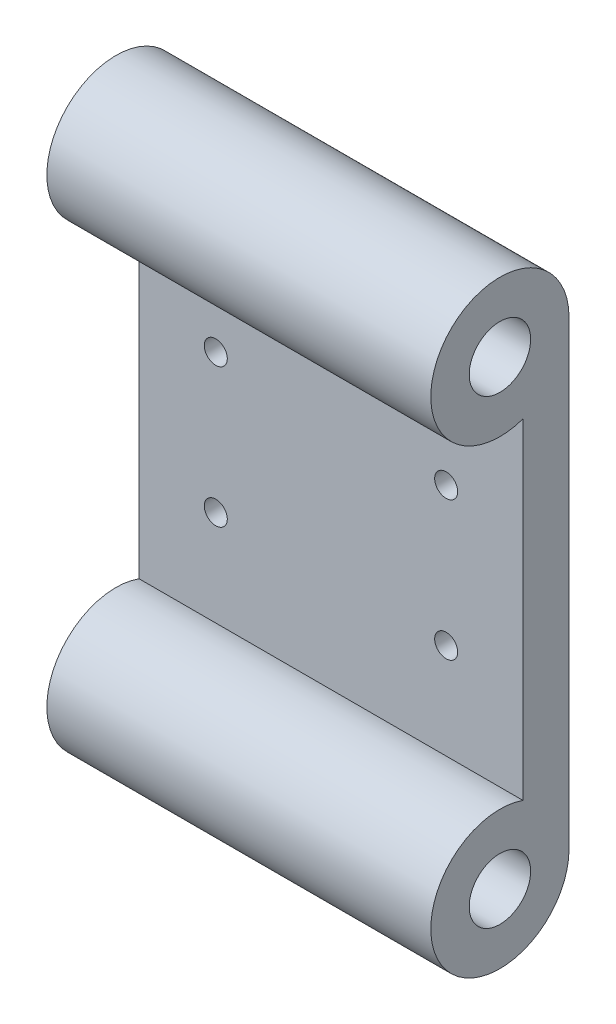
ISO-10303-21;
HEADER;
FILE_DESCRIPTION(('STEP AP214'),'2;1');
FILE_NAME('part.step','',(''),(''),'','','');
FILE_SCHEMA(('AUTOMOTIVE_DESIGN { 1 0 10303 214 1 1 1 1 }'));
ENDSEC;
DATA;
#1=APPLICATION_CONTEXT('core data for automotive mechanical design processes');
#2=APPLICATION_PROTOCOL_DEFINITION('international standard','automotive_design',2000,#1);
#3=PRODUCT_CONTEXT('',#1,'mechanical');
#4=PRODUCT('Part','Part','',(#3));
#5=PRODUCT_RELATED_PRODUCT_CATEGORY('part','',(#4));
#6=PRODUCT_DEFINITION_FORMATION('','',#4);
#7=PRODUCT_DEFINITION_CONTEXT('part definition',#1,'design');
#8=PRODUCT_DEFINITION('design','',#6,#7);
#9=PRODUCT_DEFINITION_SHAPE('','',#8);
#10=(LENGTH_UNIT() NAMED_UNIT(*) SI_UNIT(.MILLI.,.METRE.));
#11=(NAMED_UNIT(*) PLANE_ANGLE_UNIT() SI_UNIT($,.RADIAN.));
#12=(NAMED_UNIT(*) SI_UNIT($,.STERADIAN.) SOLID_ANGLE_UNIT());
#13=UNCERTAINTY_MEASURE_WITH_UNIT(LENGTH_MEASURE(1.E-05),#10,'distance_accuracy_value','');
#14=(GEOMETRIC_REPRESENTATION_CONTEXT(3) GLOBAL_UNCERTAINTY_ASSIGNED_CONTEXT((#13)) GLOBAL_UNIT_ASSIGNED_CONTEXT((#10,
#11,#12)) REPRESENTATION_CONTEXT('',''));
#15=CARTESIAN_POINT('',(0.,0.,0.));
#16=DIRECTION('',(0.,0.,1.));
#17=DIRECTION('',(1.,0.,0.));
#18=AXIS2_PLACEMENT_3D('',#15,#16,#17);
#19=CARTESIAN_POINT('',(50.,30.,0.));
#20=DIRECTION('',(1.,0.,0.));
#21=DIRECTION('',(0.,0.,-1.));
#22=AXIS2_PLACEMENT_3D('',#19,#20,#21);
#23=PLANE('',#22);
#24=CARTESIAN_POINT('',(50.,30.,0.));
#25=DIRECTION('',(1.,0.,0.));
#26=DIRECTION('',(0.,0.,-1.));
#27=AXIS2_PLACEMENT_3D('',#24,#25,#26);
#28=CIRCLE('',#27,4.);
#29=CARTESIAN_POINT('',(50.,30.,-3.99999999999999));
#30=VERTEX_POINT('',#29);
#31=EDGE_CURVE('E102',#30,#30,#28,.T.);
#32=ORIENTED_EDGE('',*,*,#31,.F.);
#33=EDGE_LOOP('',(#32));
#34=FACE_BOUND('',#33,.T.);
#35=CARTESIAN_POINT('',(50.,30.,0.));
#36=DIRECTION('',(1.,0.,0.));
#37=DIRECTION('',(0.,0.,-1.));
#38=AXIS2_PLACEMENT_3D('',#35,#36,#37);
#39=CIRCLE('',#38,9.);
#40=CARTESIAN_POINT('',(50.,30.,-8.99999999999999));
#41=VERTEX_POINT('',#40);
#42=CARTESIAN_POINT('',(50.,21.5147186257614,-2.99999999999999));
#43=VERTEX_POINT('',#42);
#44=EDGE_CURVE('E86',#41,#43,#39,.T.);
#45=ORIENTED_EDGE('',*,*,#44,.T.);
#46=DIRECTION('',(0.,-1.,0.));
#47=VECTOR('',#46,1.);
#48=CARTESIAN_POINT('',(50.,-21.5147186257614,-3.));
#49=LINE('',#48,#47);
#50=CARTESIAN_POINT('',(50.,-21.5147186257614,-3.00000000000001));
#51=VERTEX_POINT('',#50);
#52=EDGE_CURVE('E81',#43,#51,#49,.T.);
#53=ORIENTED_EDGE('',*,*,#52,.T.);
#54=CARTESIAN_POINT('',(50.,-30.,0.));
#55=DIRECTION('',(1.,0.,0.));
#56=DIRECTION('',(0.,0.,-1.));
#57=AXIS2_PLACEMENT_3D('',#54,#55,#56);
#58=CIRCLE('',#57,9.);
#59=CARTESIAN_POINT('',(50.,-30.,-9.00000000000001));
#60=VERTEX_POINT('',#59);
#61=EDGE_CURVE('E84',#51,#60,#58,.T.);
#62=ORIENTED_EDGE('',*,*,#61,.T.);
#63=DIRECTION('',(0.,1.,0.));
#64=VECTOR('',#63,1.);
#65=CARTESIAN_POINT('',(50.,30.,-8.99999999999999));
#66=LINE('',#65,#64);
#67=EDGE_CURVE('E51',#60,#41,#66,.T.);
#68=ORIENTED_EDGE('',*,*,#67,.T.);
#69=EDGE_LOOP('',(#45,#53,#62,#68));
#70=FACE_BOUND('',#69,.T.);
#71=CARTESIAN_POINT('',(50.,-30.,0.));
#72=DIRECTION('',(1.,0.,0.));
#73=DIRECTION('',(0.,0.,-1.));
#74=AXIS2_PLACEMENT_3D('',#71,#72,#73);
#75=CIRCLE('',#74,4.);
#76=CARTESIAN_POINT('',(50.,-30.,-4.00000000000001));
#77=VERTEX_POINT('',#76);
#78=EDGE_CURVE('E131',#77,#77,#75,.T.);
#79=ORIENTED_EDGE('',*,*,#78,.F.);
#80=EDGE_LOOP('',(#79));
#81=FACE_BOUND('',#80,.T.);
#82=ADVANCED_FACE('F32',(#34,#70,#81),#23,.T.);
#83=CARTESIAN_POINT('',(0.,30.,0.));
#84=DIRECTION('',(1.,0.,0.));
#85=DIRECTION('',(0.,0.,-1.));
#86=AXIS2_PLACEMENT_3D('',#83,#84,#85);
#87=PLANE('',#86);
#88=CARTESIAN_POINT('',(0.,30.,0.));
#89=DIRECTION('',(1.,0.,0.));
#90=DIRECTION('',(0.,0.,-1.));
#91=AXIS2_PLACEMENT_3D('',#88,#89,#90);
#92=CIRCLE('',#91,9.);
#93=CARTESIAN_POINT('',(0.,30.,-8.99999999999999));
#94=VERTEX_POINT('',#93);
#95=CARTESIAN_POINT('',(0.,21.5147186257614,-2.99999999999999));
#96=VERTEX_POINT('',#95);
#97=EDGE_CURVE('E99',#94,#96,#92,.T.);
#98=ORIENTED_EDGE('',*,*,#97,.F.);
#99=DIRECTION('',(0.,1.,0.));
#100=VECTOR('',#99,1.);
#101=CARTESIAN_POINT('',(0.,30.,-8.99999999999999));
#102=LINE('',#101,#100);
#103=CARTESIAN_POINT('',(0.,-30.,-9.00000000000001));
#104=VERTEX_POINT('',#103);
#105=EDGE_CURVE('E74',#104,#94,#102,.T.);
#106=ORIENTED_EDGE('',*,*,#105,.F.);
#107=CARTESIAN_POINT('',(0.,-30.,0.));
#108=DIRECTION('',(1.,0.,0.));
#109=DIRECTION('',(0.,0.,-1.));
#110=AXIS2_PLACEMENT_3D('',#107,#108,#109);
#111=CIRCLE('',#110,9.);
#112=CARTESIAN_POINT('',(0.,-21.5147186257614,-3.00000000000001));
#113=VERTEX_POINT('',#112);
#114=EDGE_CURVE('E68',#113,#104,#111,.T.);
#115=ORIENTED_EDGE('',*,*,#114,.F.);
#116=DIRECTION('',(0.,-1.,0.));
#117=VECTOR('',#116,1.);
#118=CARTESIAN_POINT('',(0.,-21.5147186257614,-3.));
#119=LINE('',#118,#117);
#120=EDGE_CURVE('E90',#96,#113,#119,.T.);
#121=ORIENTED_EDGE('',*,*,#120,.F.);
#122=EDGE_LOOP('',(#98,#106,#115,#121));
#123=FACE_BOUND('',#122,.T.);
#124=CARTESIAN_POINT('',(0.,30.,0.));
#125=DIRECTION('',(1.,0.,0.));
#126=DIRECTION('',(0.,0.,-1.));
#127=AXIS2_PLACEMENT_3D('',#124,#125,#126);
#128=CIRCLE('',#127,4.);
#129=CARTESIAN_POINT('',(0.,30.,-3.99999999999999));
#130=VERTEX_POINT('',#129);
#131=EDGE_CURVE('E134',#130,#130,#128,.T.);
#132=ORIENTED_EDGE('',*,*,#131,.T.);
#133=EDGE_LOOP('',(#132));
#134=FACE_BOUND('',#133,.T.);
#135=CARTESIAN_POINT('',(0.,-30.,0.));
#136=DIRECTION('',(1.,0.,0.));
#137=DIRECTION('',(0.,0.,-1.));
#138=AXIS2_PLACEMENT_3D('',#135,#136,#137);
#139=CIRCLE('',#138,4.);
#140=CARTESIAN_POINT('',(0.,-30.,-4.00000000000001));
#141=VERTEX_POINT('',#140);
#142=EDGE_CURVE('E111',#141,#141,#139,.T.);
#143=ORIENTED_EDGE('',*,*,#142,.T.);
#144=EDGE_LOOP('',(#143));
#145=FACE_BOUND('',#144,.T.);
#146=ADVANCED_FACE('F142',(#123,#134,#145),#87,.F.);
#147=CARTESIAN_POINT('',(50.,30.,0.));
#148=DIRECTION('',(-1.,0.,0.));
#149=DIRECTION('',(0.,0.,1.));
#150=AXIS2_PLACEMENT_3D('',#147,#148,#149);
#151=CYLINDRICAL_SURFACE('',#150,9.);
#152=ORIENTED_EDGE('',*,*,#97,.T.);
#153=DIRECTION('',(-1.,0.,0.));
#154=VECTOR('',#153,1.);
#155=CARTESIAN_POINT('',(50.,21.5147186257614,-2.99999999999999));
#156=LINE('',#155,#154);
#157=EDGE_CURVE('E11',#43,#96,#156,.T.);
#158=ORIENTED_EDGE('',*,*,#157,.F.);
#159=ORIENTED_EDGE('',*,*,#44,.F.);
#160=DIRECTION('',(-1.,0.,0.));
#161=VECTOR('',#160,1.);
#162=CARTESIAN_POINT('',(50.,30.,-8.99999999999999));
#163=LINE('',#162,#161);
#164=EDGE_CURVE('E95',#41,#94,#163,.T.);
#165=ORIENTED_EDGE('',*,*,#164,.T.);
#166=EDGE_LOOP('',(#152,#158,#159,#165));
#167=FACE_BOUND('',#166,.T.);
#168=ADVANCED_FACE('F34',(#167),#151,.T.);
#169=CARTESIAN_POINT('',(50.,-21.5147186257614,-3.));
#170=DIRECTION('',(0.,0.,-1.));
#171=DIRECTION('',(0.,1.,0.));
#172=AXIS2_PLACEMENT_3D('',#169,#170,#171);
#173=PLANE('',#172);
#174=CARTESIAN_POINT('',(40.,9.04442852285327,-3.));
#175=DIRECTION('',(0.,0.,1.));
#176=DIRECTION('',(1.,0.,0.));
#177=AXIS2_PLACEMENT_3D('',#174,#175,#176);
#178=CIRCLE('',#177,1.5);
#179=CARTESIAN_POINT('',(41.5,9.04442852285327,-3.));
#180=VERTEX_POINT('',#179);
#181=EDGE_CURVE('E116',#180,#180,#178,.T.);
#182=ORIENTED_EDGE('',*,*,#181,.F.);
#183=EDGE_LOOP('',(#182));
#184=FACE_BOUND('',#183,.T.);
#185=CARTESIAN_POINT('',(40.,-9.04442852285327,-3.));
#186=DIRECTION('',(0.,0.,1.));
#187=DIRECTION('',(1.,0.,0.));
#188=AXIS2_PLACEMENT_3D('',#185,#186,#187);
#189=CIRCLE('',#188,1.5);
#190=CARTESIAN_POINT('',(41.5,-9.04442852285327,-3.));
#191=VERTEX_POINT('',#190);
#192=EDGE_CURVE('E182',#191,#191,#189,.T.);
#193=ORIENTED_EDGE('',*,*,#192,.F.);
#194=EDGE_LOOP('',(#193));
#195=FACE_BOUND('',#194,.T.);
#196=CARTESIAN_POINT('',(10.,-9.04442852285327,-3.));
#197=DIRECTION('',(0.,0.,1.));
#198=DIRECTION('',(1.,0.,0.));
#199=AXIS2_PLACEMENT_3D('',#196,#197,#198);
#200=CIRCLE('',#199,1.5);
#201=CARTESIAN_POINT('',(11.5,-9.04442852285327,-3.));
#202=VERTEX_POINT('',#201);
#203=EDGE_CURVE('E129',#202,#202,#200,.T.);
#204=ORIENTED_EDGE('',*,*,#203,.F.);
#205=EDGE_LOOP('',(#204));
#206=FACE_BOUND('',#205,.T.);
#207=CARTESIAN_POINT('',(10.,9.04442852285326,-3.));
#208=DIRECTION('',(0.,0.,1.));
#209=DIRECTION('',(1.,0.,0.));
#210=AXIS2_PLACEMENT_3D('',#207,#208,#209);
#211=CIRCLE('',#210,1.5);
#212=CARTESIAN_POINT('',(11.5,9.04442852285326,-3.));
#213=VERTEX_POINT('',#212);
#214=EDGE_CURVE('E112',#213,#213,#211,.T.);
#215=ORIENTED_EDGE('',*,*,#214,.F.);
#216=EDGE_LOOP('',(#215));
#217=FACE_BOUND('',#216,.T.);
#218=ORIENTED_EDGE('',*,*,#120,.T.);
#219=DIRECTION('',(-1.,0.,0.));
#220=VECTOR('',#219,1.);
#221=CARTESIAN_POINT('',(50.,-21.5147186257614,-3.00000000000001));
#222=LINE('',#221,#220);
#223=EDGE_CURVE('E42',#51,#113,#222,.T.);
#224=ORIENTED_EDGE('',*,*,#223,.F.);
#225=ORIENTED_EDGE('',*,*,#52,.F.);
#226=ORIENTED_EDGE('',*,*,#157,.T.);
#227=EDGE_LOOP('',(#218,#224,#225,#226));
#228=FACE_BOUND('',#227,.T.);
#229=ADVANCED_FACE('F89',(#184,#195,#206,#217,#228),#173,.F.);
#230=CARTESIAN_POINT('',(50.,-30.,0.));
#231=DIRECTION('',(-1.,0.,0.));
#232=DIRECTION('',(0.,0.,1.));
#233=AXIS2_PLACEMENT_3D('',#230,#231,#232);
#234=CYLINDRICAL_SURFACE('',#233,9.);
#235=ORIENTED_EDGE('',*,*,#114,.T.);
#236=DIRECTION('',(-1.,0.,0.));
#237=VECTOR('',#236,1.);
#238=CARTESIAN_POINT('',(50.,-30.,-9.00000000000001));
#239=LINE('',#238,#237);
#240=EDGE_CURVE('E91',#60,#104,#239,.T.);
#241=ORIENTED_EDGE('',*,*,#240,.F.);
#242=ORIENTED_EDGE('',*,*,#61,.F.);
#243=ORIENTED_EDGE('',*,*,#223,.T.);
#244=EDGE_LOOP('',(#235,#241,#242,#243));
#245=FACE_BOUND('',#244,.T.);
#246=ADVANCED_FACE('F93',(#245),#234,.T.);
#247=CARTESIAN_POINT('',(50.,30.,-8.99999999999999));
#248=DIRECTION('',(0.,0.,1.));
#249=DIRECTION('',(0.,-1.,0.));
#250=AXIS2_PLACEMENT_3D('',#247,#248,#249);
#251=PLANE('',#250);
#252=CARTESIAN_POINT('',(40.,9.04442852285327,-9.));
#253=DIRECTION('',(0.,0.,1.));
#254=DIRECTION('',(0.,-1.,0.));
#255=AXIS2_PLACEMENT_3D('',#252,#253,#254);
#256=CIRCLE('',#255,1.5);
#257=CARTESIAN_POINT('',(40.,7.54442852285326,-9.));
#258=VERTEX_POINT('',#257);
#259=EDGE_CURVE('E36',#258,#258,#256,.T.);
#260=ORIENTED_EDGE('',*,*,#259,.T.);
#261=EDGE_LOOP('',(#260));
#262=FACE_BOUND('',#261,.T.);
#263=CARTESIAN_POINT('',(40.,-9.04442852285327,-9.00000000000001));
#264=DIRECTION('',(0.,0.,1.));
#265=DIRECTION('',(0.,-1.,0.));
#266=AXIS2_PLACEMENT_3D('',#263,#264,#265);
#267=CIRCLE('',#266,1.5);
#268=CARTESIAN_POINT('',(40.,-10.5444285228533,-9.00000000000001));
#269=VERTEX_POINT('',#268);
#270=EDGE_CURVE('E115',#269,#269,#267,.T.);
#271=ORIENTED_EDGE('',*,*,#270,.T.);
#272=EDGE_LOOP('',(#271));
#273=FACE_BOUND('',#272,.T.);
#274=CARTESIAN_POINT('',(10.,-9.04442852285327,-9.00000000000001));
#275=DIRECTION('',(0.,0.,1.));
#276=DIRECTION('',(0.,-1.,0.));
#277=AXIS2_PLACEMENT_3D('',#274,#275,#276);
#278=CIRCLE('',#277,1.5);
#279=CARTESIAN_POINT('',(10.,-10.5444285228533,-9.00000000000001));
#280=VERTEX_POINT('',#279);
#281=EDGE_CURVE('E113',#280,#280,#278,.T.);
#282=ORIENTED_EDGE('',*,*,#281,.T.);
#283=EDGE_LOOP('',(#282));
#284=FACE_BOUND('',#283,.T.);
#285=CARTESIAN_POINT('',(10.,9.04442852285326,-9.));
#286=DIRECTION('',(0.,0.,1.));
#287=DIRECTION('',(0.,-1.,0.));
#288=AXIS2_PLACEMENT_3D('',#285,#286,#287);
#289=CIRCLE('',#288,1.5);
#290=CARTESIAN_POINT('',(10.,7.54442852285326,-9.));
#291=VERTEX_POINT('',#290);
#292=EDGE_CURVE('E108',#291,#291,#289,.T.);
#293=ORIENTED_EDGE('',*,*,#292,.T.);
#294=EDGE_LOOP('',(#293));
#295=FACE_BOUND('',#294,.T.);
#296=ORIENTED_EDGE('',*,*,#105,.T.);
#297=ORIENTED_EDGE('',*,*,#164,.F.);
#298=ORIENTED_EDGE('',*,*,#67,.F.);
#299=ORIENTED_EDGE('',*,*,#240,.T.);
#300=EDGE_LOOP('',(#296,#297,#298,#299));
#301=FACE_BOUND('',#300,.T.);
#302=ADVANCED_FACE('F148',(#262,#273,#284,#295,#301),#251,.F.);
#303=CARTESIAN_POINT('',(50.,30.,0.));
#304=DIRECTION('',(-1.,0.,0.));
#305=DIRECTION('',(0.,0.,1.));
#306=AXIS2_PLACEMENT_3D('',#303,#304,#305);
#307=CYLINDRICAL_SURFACE('',#306,4.);
#308=ORIENTED_EDGE('',*,*,#31,.T.);
#309=EDGE_LOOP('',(#308));
#310=FACE_BOUND('',#309,.T.);
#311=ORIENTED_EDGE('',*,*,#131,.F.);
#312=EDGE_LOOP('',(#311));
#313=FACE_BOUND('',#312,.T.);
#314=ADVANCED_FACE('F145',(#310,#313),#307,.F.);
#315=CARTESIAN_POINT('',(50.,-30.,0.));
#316=DIRECTION('',(-1.,0.,0.));
#317=DIRECTION('',(0.,0.,1.));
#318=AXIS2_PLACEMENT_3D('',#315,#316,#317);
#319=CYLINDRICAL_SURFACE('',#318,4.);
#320=ORIENTED_EDGE('',*,*,#78,.T.);
#321=EDGE_LOOP('',(#320));
#322=FACE_BOUND('',#321,.T.);
#323=ORIENTED_EDGE('',*,*,#142,.F.);
#324=EDGE_LOOP('',(#323));
#325=FACE_BOUND('',#324,.T.);
#326=ADVANCED_FACE('F147',(#322,#325),#319,.F.);
#327=CARTESIAN_POINT('',(10.,9.04442852285326,-43.));
#328=DIRECTION('',(0.,0.,1.));
#329=DIRECTION('',(1.,0.,0.));
#330=AXIS2_PLACEMENT_3D('',#327,#328,#329);
#331=CYLINDRICAL_SURFACE('',#330,1.5);
#332=ORIENTED_EDGE('',*,*,#214,.T.);
#333=EDGE_LOOP('',(#332));
#334=FACE_BOUND('',#333,.T.);
#335=ORIENTED_EDGE('',*,*,#292,.F.);
#336=EDGE_LOOP('',(#335));
#337=FACE_BOUND('',#336,.T.);
#338=ADVANCED_FACE('F155',(#334,#337),#331,.F.);
#339=CARTESIAN_POINT('',(10.,-9.04442852285327,-43.));
#340=DIRECTION('',(0.,0.,1.));
#341=DIRECTION('',(1.,0.,0.));
#342=AXIS2_PLACEMENT_3D('',#339,#340,#341);
#343=CYLINDRICAL_SURFACE('',#342,1.5);
#344=ORIENTED_EDGE('',*,*,#203,.T.);
#345=EDGE_LOOP('',(#344));
#346=FACE_BOUND('',#345,.T.);
#347=ORIENTED_EDGE('',*,*,#281,.F.);
#348=EDGE_LOOP('',(#347));
#349=FACE_BOUND('',#348,.T.);
#350=ADVANCED_FACE('F198',(#346,#349),#343,.F.);
#351=CARTESIAN_POINT('',(40.,-9.04442852285327,-43.));
#352=DIRECTION('',(0.,0.,1.));
#353=DIRECTION('',(1.,0.,0.));
#354=AXIS2_PLACEMENT_3D('',#351,#352,#353);
#355=CYLINDRICAL_SURFACE('',#354,1.5);
#356=ORIENTED_EDGE('',*,*,#192,.T.);
#357=EDGE_LOOP('',(#356));
#358=FACE_BOUND('',#357,.T.);
#359=ORIENTED_EDGE('',*,*,#270,.F.);
#360=EDGE_LOOP('',(#359));
#361=FACE_BOUND('',#360,.T.);
#362=ADVANCED_FACE('F193',(#358,#361),#355,.F.);
#363=CARTESIAN_POINT('',(40.,9.04442852285327,-43.));
#364=DIRECTION('',(0.,0.,1.));
#365=DIRECTION('',(1.,0.,0.));
#366=AXIS2_PLACEMENT_3D('',#363,#364,#365);
#367=CYLINDRICAL_SURFACE('',#366,1.5);
#368=ORIENTED_EDGE('',*,*,#181,.T.);
#369=EDGE_LOOP('',(#368));
#370=FACE_BOUND('',#369,.T.);
#371=ORIENTED_EDGE('',*,*,#259,.F.);
#372=EDGE_LOOP('',(#371));
#373=FACE_BOUND('',#372,.T.);
#374=ADVANCED_FACE('F190',(#370,#373),#367,.F.);
#375=CLOSED_SHELL('',(#82,#146,#168,#229,#246,#302,#314,#326,#338,#350,#362,#374));
#376=MANIFOLD_SOLID_BREP('B2',#375);
#377=ADVANCED_BREP_SHAPE_REPRESENTATION('',(#18,#376),#14);
#378=SHAPE_DEFINITION_REPRESENTATION(#9,#377);
ENDSEC;
END-ISO-10303-21;
